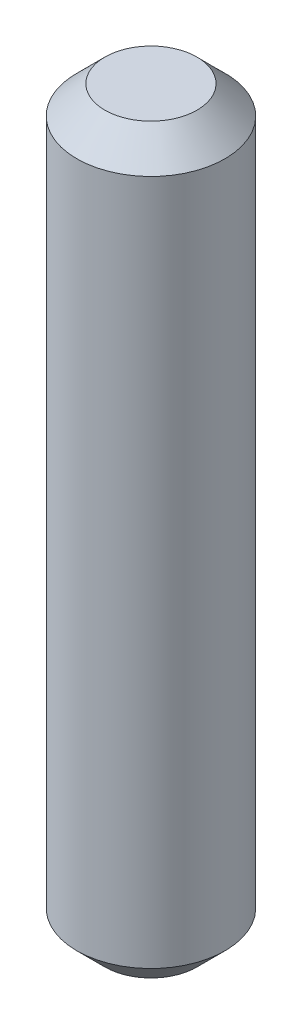
ISO-10303-21;
HEADER;
FILE_DESCRIPTION(('STEP AP214'),'2;1');
FILE_NAME('part.step','',(''),(''),'','','');
FILE_SCHEMA(('AUTOMOTIVE_DESIGN { 1 0 10303 214 1 1 1 1 }'));
ENDSEC;
DATA;
#1=APPLICATION_CONTEXT('core data for automotive mechanical design processes');
#2=APPLICATION_PROTOCOL_DEFINITION('international standard','automotive_design',2000,#1);
#3=PRODUCT_CONTEXT('',#1,'mechanical');
#4=PRODUCT('Part','Part','',(#3));
#5=PRODUCT_RELATED_PRODUCT_CATEGORY('part','',(#4));
#6=PRODUCT_DEFINITION_FORMATION('','',#4);
#7=PRODUCT_DEFINITION_CONTEXT('part definition',#1,'design');
#8=PRODUCT_DEFINITION('design','',#6,#7);
#9=PRODUCT_DEFINITION_SHAPE('','',#8);
#10=(LENGTH_UNIT() NAMED_UNIT(*) SI_UNIT(.MILLI.,.METRE.));
#11=(NAMED_UNIT(*) PLANE_ANGLE_UNIT() SI_UNIT($,.RADIAN.));
#12=(NAMED_UNIT(*) SI_UNIT($,.STERADIAN.) SOLID_ANGLE_UNIT());
#13=UNCERTAINTY_MEASURE_WITH_UNIT(LENGTH_MEASURE(1.E-05),#10,'distance_accuracy_value','');
#14=(GEOMETRIC_REPRESENTATION_CONTEXT(3) GLOBAL_UNCERTAINTY_ASSIGNED_CONTEXT((#13)) GLOBAL_UNIT_ASSIGNED_CONTEXT((#10,
#11,#12)) REPRESENTATION_CONTEXT('',''));
#15=CARTESIAN_POINT('',(0.,0.,0.));
#16=DIRECTION('',(0.,0.,1.));
#17=DIRECTION('',(1.,0.,0.));
#18=AXIS2_PLACEMENT_3D('',#15,#16,#17);
#19=CARTESIAN_POINT('',(0.,15.87,0.));
#20=DIRECTION('',(0.,-1.,0.));
#21=DIRECTION('',(0.,0.,-1.));
#22=AXIS2_PLACEMENT_3D('',#19,#20,#21);
#23=CYLINDRICAL_SURFACE('',#22,1.585);
#24=CARTESIAN_POINT('',(0.,0.599999999999998,0.));
#25=DIRECTION('',(0.,1.,0.));
#26=DIRECTION('',(0.,0.,1.));
#27=AXIS2_PLACEMENT_3D('',#24,#25,#26);
#28=CIRCLE('',#27,1.585);
#29=CARTESIAN_POINT('',(0.,0.599999999999998,1.585));
#30=VERTEX_POINT('',#29);
#31=EDGE_CURVE('E48',#30,#30,#28,.T.);
#32=ORIENTED_EDGE('',*,*,#31,.T.);
#33=EDGE_LOOP('',(#32));
#34=FACE_BOUND('',#33,.T.);
#35=CARTESIAN_POINT('',(0.,15.27,0.));
#36=DIRECTION('',(0.,1.,0.));
#37=DIRECTION('',(0.,0.,1.));
#38=AXIS2_PLACEMENT_3D('',#35,#36,#37);
#39=CIRCLE('',#38,1.585);
#40=CARTESIAN_POINT('',(0.,15.27,1.585));
#41=VERTEX_POINT('',#40);
#42=EDGE_CURVE('E53',#41,#41,#39,.F.);
#43=ORIENTED_EDGE('',*,*,#42,.T.);
#44=EDGE_LOOP('',(#43));
#45=FACE_BOUND('',#44,.T.);
#46=ADVANCED_FACE('F39',(#34,#45),#23,.T.);
#47=CARTESIAN_POINT('',(0.,15.87,0.));
#48=DIRECTION('',(0.,1.,0.));
#49=DIRECTION('',(0.,0.,1.));
#50=AXIS2_PLACEMENT_3D('',#47,#48,#49);
#51=PLANE('',#50);
#52=CARTESIAN_POINT('',(0.,15.87,0.));
#53=DIRECTION('',(0.,1.,0.));
#54=DIRECTION('',(0.,0.,1.));
#55=AXIS2_PLACEMENT_3D('',#52,#53,#54);
#56=CIRCLE('',#55,0.984999999999998);
#57=CARTESIAN_POINT('',(0.,15.87,0.984999999999998));
#58=VERTEX_POINT('',#57);
#59=EDGE_CURVE('E58',#58,#58,#56,.T.);
#60=ORIENTED_EDGE('',*,*,#59,.T.);
#61=EDGE_LOOP('',(#60));
#62=FACE_BOUND('',#61,.T.);
#63=ADVANCED_FACE('F65',(#62),#51,.T.);
#64=CARTESIAN_POINT('',(0.,0.,0.));
#65=DIRECTION('',(0.,1.,0.));
#66=DIRECTION('',(0.,0.,1.));
#67=AXIS2_PLACEMENT_3D('',#64,#65,#66);
#68=PLANE('',#67);
#69=CARTESIAN_POINT('',(0.,0.,0.));
#70=DIRECTION('',(0.,1.,0.));
#71=DIRECTION('',(0.,0.,1.));
#72=AXIS2_PLACEMENT_3D('',#69,#70,#71);
#73=CIRCLE('',#72,0.984999999999998);
#74=CARTESIAN_POINT('',(0.,0.,0.984999999999998));
#75=VERTEX_POINT('',#74);
#76=EDGE_CURVE('E10',#75,#75,#73,.F.);
#77=ORIENTED_EDGE('',*,*,#76,.T.);
#78=EDGE_LOOP('',(#77));
#79=FACE_BOUND('',#78,.T.);
#80=ADVANCED_FACE('F69',(#79),#68,.F.);
#81=CARTESIAN_POINT('',(0.,15.87,0.));
#82=DIRECTION('',(0.,-1.,0.));
#83=DIRECTION('',(0.,0.,-1.));
#84=AXIS2_PLACEMENT_3D('',#81,#82,#83);
#85=CONICAL_SURFACE('',#84,0.984999999999998,0.785398163397447);
#86=ORIENTED_EDGE('',*,*,#42,.F.);
#87=EDGE_LOOP('',(#86));
#88=FACE_BOUND('',#87,.T.);
#89=ORIENTED_EDGE('',*,*,#59,.F.);
#90=EDGE_LOOP('',(#89));
#91=FACE_BOUND('',#90,.T.);
#92=ADVANCED_FACE('F67',(#88,#91),#85,.T.);
#93=CARTESIAN_POINT('',(0.,0.599999999999998,0.));
#94=DIRECTION('',(0.,1.,0.));
#95=DIRECTION('',(0.,0.,1.));
#96=AXIS2_PLACEMENT_3D('',#93,#94,#95);
#97=CONICAL_SURFACE('',#96,1.585,0.785398163397451);
#98=ORIENTED_EDGE('',*,*,#76,.F.);
#99=EDGE_LOOP('',(#98));
#100=FACE_BOUND('',#99,.T.);
#101=ORIENTED_EDGE('',*,*,#31,.F.);
#102=EDGE_LOOP('',(#101));
#103=FACE_BOUND('',#102,.T.);
#104=ADVANCED_FACE('F42',(#100,#103),#97,.T.);
#105=CLOSED_SHELL('',(#46,#63,#80,#92,#104));
#106=MANIFOLD_SOLID_BREP('B2',#105);
#107=ADVANCED_BREP_SHAPE_REPRESENTATION('',(#18,#106),#14);
#108=SHAPE_DEFINITION_REPRESENTATION(#9,#107);
ENDSEC;
END-ISO-10303-21;
